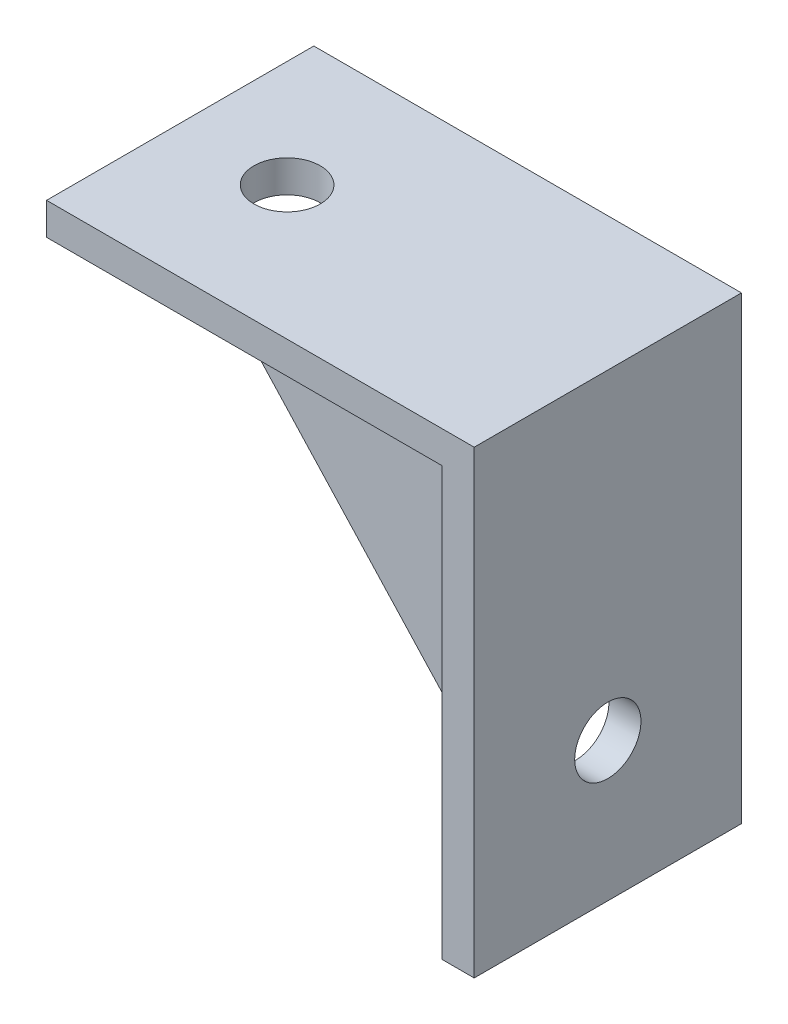
ISO-10303-21;
HEADER;
FILE_DESCRIPTION(('STEP AP214'),'2;1');
FILE_NAME('part.step','',(''),(''),'','','');
FILE_SCHEMA(('AUTOMOTIVE_DESIGN { 1 0 10303 214 1 1 1 1 }'));
ENDSEC;
DATA;
#1=APPLICATION_CONTEXT('core data for automotive mechanical design processes');
#2=APPLICATION_PROTOCOL_DEFINITION('international standard','automotive_design',2000,#1);
#3=PRODUCT_CONTEXT('',#1,'mechanical');
#4=PRODUCT('Part','Part','',(#3));
#5=PRODUCT_RELATED_PRODUCT_CATEGORY('part','',(#4));
#6=PRODUCT_DEFINITION_FORMATION('','',#4);
#7=PRODUCT_DEFINITION_CONTEXT('part definition',#1,'design');
#8=PRODUCT_DEFINITION('design','',#6,#7);
#9=PRODUCT_DEFINITION_SHAPE('','',#8);
#10=(LENGTH_UNIT() NAMED_UNIT(*) SI_UNIT(.MILLI.,.METRE.));
#11=(NAMED_UNIT(*) PLANE_ANGLE_UNIT() SI_UNIT($,.RADIAN.));
#12=(NAMED_UNIT(*) SI_UNIT($,.STERADIAN.) SOLID_ANGLE_UNIT());
#13=UNCERTAINTY_MEASURE_WITH_UNIT(LENGTH_MEASURE(1.E-05),#10,'distance_accuracy_value','');
#14=(GEOMETRIC_REPRESENTATION_CONTEXT(3) GLOBAL_UNCERTAINTY_ASSIGNED_CONTEXT((#13)) GLOBAL_UNIT_ASSIGNED_CONTEXT((#10,
#11,#12)) REPRESENTATION_CONTEXT('',''));
#15=CARTESIAN_POINT('',(0.,0.,0.));
#16=DIRECTION('',(0.,0.,1.));
#17=DIRECTION('',(1.,0.,0.));
#18=AXIS2_PLACEMENT_3D('',#15,#16,#17);
#19=CARTESIAN_POINT('',(0.,0.,0.));
#20=DIRECTION('',(0.,1.,0.));
#21=DIRECTION('',(0.,0.,1.));
#22=AXIS2_PLACEMENT_3D('',#19,#20,#21);
#23=PLANE('',#22);
#24=CARTESIAN_POINT('',(10.,0.,12.5));
#25=DIRECTION('',(0.,1.,0.));
#26=DIRECTION('',(0.,0.,1.));
#27=AXIS2_PLACEMENT_3D('',#24,#25,#26);
#28=CIRCLE('',#27,3.1);
#29=CARTESIAN_POINT('',(10.,0.,15.6));
#30=VERTEX_POINT('',#29);
#31=EDGE_CURVE('E154',#30,#30,#28,.T.);
#32=ORIENTED_EDGE('',*,*,#31,.T.);
#33=EDGE_LOOP('',(#32));
#34=FACE_BOUND('',#33,.T.);
#35=DIRECTION('',(-1.,0.,0.));
#36=VECTOR('',#35,1.);
#37=CARTESIAN_POINT('',(37.,0.,22.5));
#38=LINE('',#37,#36);
#39=CARTESIAN_POINT('',(37.,0.,22.5));
#40=VERTEX_POINT('',#39);
#41=CARTESIAN_POINT('',(15.2752875538916,0.,22.5));
#42=VERTEX_POINT('',#41);
#43=EDGE_CURVE('E120',#40,#42,#38,.T.);
#44=ORIENTED_EDGE('',*,*,#43,.F.);
#45=DIRECTION('',(0.,0.,-1.));
#46=VECTOR('',#45,1.);
#47=CARTESIAN_POINT('',(37.,0.,25.));
#48=LINE('',#47,#46);
#49=CARTESIAN_POINT('',(37.,0.,25.));
#50=VERTEX_POINT('',#49);
#51=EDGE_CURVE('E60',#50,#40,#48,.T.);
#52=ORIENTED_EDGE('',*,*,#51,.F.);
#53=DIRECTION('',(1.,0.,0.));
#54=VECTOR('',#53,1.);
#55=CARTESIAN_POINT('',(0.,0.,25.));
#56=LINE('',#55,#54);
#57=CARTESIAN_POINT('',(0.,0.,25.));
#58=VERTEX_POINT('',#57);
#59=EDGE_CURVE('E174',#58,#50,#56,.T.);
#60=ORIENTED_EDGE('',*,*,#59,.F.);
#61=DIRECTION('',(0.,0.,1.));
#62=VECTOR('',#61,1.);
#63=CARTESIAN_POINT('',(0.,0.,0.));
#64=LINE('',#63,#62);
#65=CARTESIAN_POINT('',(0.,0.,0.));
#66=VERTEX_POINT('',#65);
#67=EDGE_CURVE('E158',#66,#58,#64,.T.);
#68=ORIENTED_EDGE('',*,*,#67,.F.);
#69=DIRECTION('',(-1.,0.,0.));
#70=VECTOR('',#69,1.);
#71=CARTESIAN_POINT('',(0.,0.,0.));
#72=LINE('',#71,#70);
#73=CARTESIAN_POINT('',(37.,0.,0.));
#74=VERTEX_POINT('',#73);
#75=EDGE_CURVE('E165',#74,#66,#72,.T.);
#76=ORIENTED_EDGE('',*,*,#75,.F.);
#77=CARTESIAN_POINT('',(37.,0.,2.5));
#78=VERTEX_POINT('',#77);
#79=EDGE_CURVE('E135',#78,#74,#48,.T.);
#80=ORIENTED_EDGE('',*,*,#79,.F.);
#81=DIRECTION('',(-1.,0.,0.));
#82=VECTOR('',#81,1.);
#83=CARTESIAN_POINT('',(37.,0.,2.5));
#84=LINE('',#83,#82);
#85=CARTESIAN_POINT('',(15.2752875538916,0.,2.5));
#86=VERTEX_POINT('',#85);
#87=EDGE_CURVE('E52',#78,#86,#84,.T.);
#88=ORIENTED_EDGE('',*,*,#87,.T.);
#89=DIRECTION('',(0.,0.,-1.));
#90=VECTOR('',#89,1.);
#91=CARTESIAN_POINT('',(15.2752875538916,0.,22.5));
#92=LINE('',#91,#90);
#93=EDGE_CURVE('E114',#42,#86,#92,.T.);
#94=ORIENTED_EDGE('',*,*,#93,.F.);
#95=EDGE_LOOP('',(#44,#52,#60,#68,#76,#80,#88,#94));
#96=FACE_BOUND('',#95,.T.);
#97=ADVANCED_FACE('F37',(#34,#96),#23,.F.);
#98=CARTESIAN_POINT('',(37.,-40.,25.));
#99=DIRECTION('',(1.,0.,0.));
#100=DIRECTION('',(0.,0.,-1.));
#101=AXIS2_PLACEMENT_3D('',#98,#99,#100);
#102=PLANE('',#101);
#103=CARTESIAN_POINT('',(37.,-27.,12.5));
#104=DIRECTION('',(-1.,0.,0.));
#105=DIRECTION('',(0.,0.,1.));
#106=AXIS2_PLACEMENT_3D('',#103,#104,#105);
#107=CIRCLE('',#106,3.1);
#108=CARTESIAN_POINT('',(37.,-27.,15.6));
#109=VERTEX_POINT('',#108);
#110=EDGE_CURVE('E126',#109,#109,#107,.T.);
#111=ORIENTED_EDGE('',*,*,#110,.F.);
#112=EDGE_LOOP('',(#111));
#113=FACE_BOUND('',#112,.T.);
#114=DIRECTION('',(0.,1.,0.));
#115=VECTOR('',#114,1.);
#116=CARTESIAN_POINT('',(37.,-23.5909327367695,22.5));
#117=LINE('',#116,#115);
#118=CARTESIAN_POINT('',(37.,-23.5909327367695,22.5));
#119=VERTEX_POINT('',#118);
#120=EDGE_CURVE('E119',#119,#40,#117,.T.);
#121=ORIENTED_EDGE('',*,*,#120,.F.);
#122=DIRECTION('',(0.,0.,-1.));
#123=VECTOR('',#122,1.);
#124=CARTESIAN_POINT('',(37.,-23.5909327367695,22.5));
#125=LINE('',#124,#123);
#126=CARTESIAN_POINT('',(37.,-23.5909327367695,2.5));
#127=VERTEX_POINT('',#126);
#128=EDGE_CURVE('E116',#119,#127,#125,.T.);
#129=ORIENTED_EDGE('',*,*,#128,.T.);
#130=DIRECTION('',(0.,1.,0.));
#131=VECTOR('',#130,1.);
#132=CARTESIAN_POINT('',(37.,-23.5909327367695,2.5));
#133=LINE('',#132,#131);
#134=EDGE_CURVE('E123',#127,#78,#133,.T.);
#135=ORIENTED_EDGE('',*,*,#134,.T.);
#136=ORIENTED_EDGE('',*,*,#79,.T.);
#137=DIRECTION('',(0.,1.,0.));
#138=VECTOR('',#137,1.);
#139=CARTESIAN_POINT('',(37.,-40.,0.));
#140=LINE('',#139,#138);
#141=CARTESIAN_POINT('',(37.,-40.,0.));
#142=VERTEX_POINT('',#141);
#143=EDGE_CURVE('E147',#142,#74,#140,.T.);
#144=ORIENTED_EDGE('',*,*,#143,.F.);
#145=DIRECTION('',(0.,0.,-1.));
#146=VECTOR('',#145,1.);
#147=CARTESIAN_POINT('',(37.,-40.,25.));
#148=LINE('',#147,#146);
#149=CARTESIAN_POINT('',(37.,-40.,25.));
#150=VERTEX_POINT('',#149);
#151=EDGE_CURVE('E142',#150,#142,#148,.T.);
#152=ORIENTED_EDGE('',*,*,#151,.F.);
#153=DIRECTION('',(0.,1.,0.));
#154=VECTOR('',#153,1.);
#155=CARTESIAN_POINT('',(37.,-40.,25.));
#156=LINE('',#155,#154);
#157=EDGE_CURVE('E151',#150,#50,#156,.T.);
#158=ORIENTED_EDGE('',*,*,#157,.T.);
#159=ORIENTED_EDGE('',*,*,#51,.T.);
#160=EDGE_LOOP('',(#121,#129,#135,#136,#144,#152,#158,#159));
#161=FACE_BOUND('',#160,.T.);
#162=ADVANCED_FACE('F208',(#113,#161),#102,.F.);
#163=CARTESIAN_POINT('',(0.,3.,0.));
#164=DIRECTION('',(0.,1.,0.));
#165=DIRECTION('',(0.,0.,1.));
#166=AXIS2_PLACEMENT_3D('',#163,#164,#165);
#167=PLANE('',#166);
#168=DIRECTION('',(0.,0.,1.));
#169=VECTOR('',#168,1.);
#170=CARTESIAN_POINT('',(0.,3.,0.));
#171=LINE('',#170,#169);
#172=CARTESIAN_POINT('',(0.,3.,0.));
#173=VERTEX_POINT('',#172);
#174=CARTESIAN_POINT('',(0.,3.,25.));
#175=VERTEX_POINT('',#174);
#176=EDGE_CURVE('E161',#173,#175,#171,.T.);
#177=ORIENTED_EDGE('',*,*,#176,.T.);
#178=DIRECTION('',(1.,0.,0.));
#179=VECTOR('',#178,1.);
#180=CARTESIAN_POINT('',(0.,3.,25.));
#181=LINE('',#180,#179);
#182=CARTESIAN_POINT('',(40.,3.,25.));
#183=VERTEX_POINT('',#182);
#184=EDGE_CURVE('E164',#175,#183,#181,.T.);
#185=ORIENTED_EDGE('',*,*,#184,.T.);
#186=DIRECTION('',(0.,0.,-1.));
#187=VECTOR('',#186,1.);
#188=CARTESIAN_POINT('',(40.,3.,0.));
#189=LINE('',#188,#187);
#190=CARTESIAN_POINT('',(40.,3.,0.));
#191=VERTEX_POINT('',#190);
#192=EDGE_CURVE('E167',#183,#191,#189,.T.);
#193=ORIENTED_EDGE('',*,*,#192,.T.);
#194=DIRECTION('',(-1.,0.,0.));
#195=VECTOR('',#194,1.);
#196=CARTESIAN_POINT('',(0.,3.,0.));
#197=LINE('',#196,#195);
#198=EDGE_CURVE('E169',#191,#173,#197,.T.);
#199=ORIENTED_EDGE('',*,*,#198,.T.);
#200=EDGE_LOOP('',(#177,#185,#193,#199));
#201=FACE_BOUND('',#200,.T.);
#202=CARTESIAN_POINT('',(10.,3.,12.5));
#203=DIRECTION('',(0.,1.,0.));
#204=DIRECTION('',(0.,0.,1.));
#205=AXIS2_PLACEMENT_3D('',#202,#203,#204);
#206=CIRCLE('',#205,3.1);
#207=CARTESIAN_POINT('',(10.,3.,15.6));
#208=VERTEX_POINT('',#207);
#209=EDGE_CURVE('E155',#208,#208,#206,.T.);
#210=ORIENTED_EDGE('',*,*,#209,.F.);
#211=EDGE_LOOP('',(#210));
#212=FACE_BOUND('',#211,.T.);
#213=ADVANCED_FACE('F201',(#201,#212),#167,.T.);
#214=CARTESIAN_POINT('',(0.,3.,0.));
#215=DIRECTION('',(1.,0.,0.));
#216=DIRECTION('',(0.,0.,-1.));
#217=AXIS2_PLACEMENT_3D('',#214,#215,#216);
#218=PLANE('',#217);
#219=ORIENTED_EDGE('',*,*,#67,.T.);
#220=DIRECTION('',(0.,-1.,0.));
#221=VECTOR('',#220,1.);
#222=CARTESIAN_POINT('',(0.,3.,25.));
#223=LINE('',#222,#221);
#224=EDGE_CURVE('E11',#175,#58,#223,.T.);
#225=ORIENTED_EDGE('',*,*,#224,.F.);
#226=ORIENTED_EDGE('',*,*,#176,.F.);
#227=DIRECTION('',(0.,-1.,0.));
#228=VECTOR('',#227,1.);
#229=CARTESIAN_POINT('',(0.,3.,0.));
#230=LINE('',#229,#228);
#231=EDGE_CURVE('E171',#173,#66,#230,.T.);
#232=ORIENTED_EDGE('',*,*,#231,.T.);
#233=EDGE_LOOP('',(#219,#225,#226,#232));
#234=FACE_BOUND('',#233,.T.);
#235=ADVANCED_FACE('F39',(#234),#218,.F.);
#236=CARTESIAN_POINT('',(0.,3.,25.));
#237=DIRECTION('',(0.,0.,-1.));
#238=DIRECTION('',(-1.,0.,0.));
#239=AXIS2_PLACEMENT_3D('',#236,#237,#238);
#240=PLANE('',#239);
#241=ORIENTED_EDGE('',*,*,#59,.T.);
#242=ORIENTED_EDGE('',*,*,#157,.F.);
#243=DIRECTION('',(-1.,0.,0.));
#244=VECTOR('',#243,1.);
#245=CARTESIAN_POINT('',(40.,-40.,25.));
#246=LINE('',#245,#244);
#247=CARTESIAN_POINT('',(40.,-40.,25.));
#248=VERTEX_POINT('',#247);
#249=EDGE_CURVE('E140',#248,#150,#246,.T.);
#250=ORIENTED_EDGE('',*,*,#249,.F.);
#251=DIRECTION('',(0.,-1.,0.));
#252=VECTOR('',#251,1.);
#253=CARTESIAN_POINT('',(40.,3.,25.));
#254=LINE('',#253,#252);
#255=EDGE_CURVE('E45',#183,#248,#254,.T.);
#256=ORIENTED_EDGE('',*,*,#255,.F.);
#257=ORIENTED_EDGE('',*,*,#184,.F.);
#258=ORIENTED_EDGE('',*,*,#224,.T.);
#259=EDGE_LOOP('',(#241,#242,#250,#256,#257,#258));
#260=FACE_BOUND('',#259,.T.);
#261=ADVANCED_FACE('F189',(#260),#240,.F.);
#262=CARTESIAN_POINT('',(40.,3.,0.));
#263=DIRECTION('',(-1.,0.,0.));
#264=DIRECTION('',(0.,0.,1.));
#265=AXIS2_PLACEMENT_3D('',#262,#263,#264);
#266=PLANE('',#265);
#267=CARTESIAN_POINT('',(40.,-27.,12.5));
#268=DIRECTION('',(-1.,0.,0.));
#269=DIRECTION('',(0.,0.,1.));
#270=AXIS2_PLACEMENT_3D('',#267,#268,#269);
#271=CIRCLE('',#270,3.1);
#272=CARTESIAN_POINT('',(40.,-27.,15.6));
#273=VERTEX_POINT('',#272);
#274=EDGE_CURVE('E129',#273,#273,#271,.T.);
#275=ORIENTED_EDGE('',*,*,#274,.T.);
#276=EDGE_LOOP('',(#275));
#277=FACE_BOUND('',#276,.T.);
#278=ORIENTED_EDGE('',*,*,#255,.T.);
#279=DIRECTION('',(0.,0.,1.));
#280=VECTOR('',#279,1.);
#281=CARTESIAN_POINT('',(40.,-40.,25.));
#282=LINE('',#281,#280);
#283=CARTESIAN_POINT('',(40.,-40.,0.));
#284=VERTEX_POINT('',#283);
#285=EDGE_CURVE('E137',#284,#248,#282,.T.);
#286=ORIENTED_EDGE('',*,*,#285,.F.);
#287=DIRECTION('',(0.,-1.,0.));
#288=VECTOR('',#287,1.);
#289=CARTESIAN_POINT('',(40.,3.,0.));
#290=LINE('',#289,#288);
#291=EDGE_CURVE('E179',#191,#284,#290,.T.);
#292=ORIENTED_EDGE('',*,*,#291,.F.);
#293=ORIENTED_EDGE('',*,*,#192,.F.);
#294=EDGE_LOOP('',(#278,#286,#292,#293));
#295=FACE_BOUND('',#294,.T.);
#296=ADVANCED_FACE('F185',(#277,#295),#266,.F.);
#297=CARTESIAN_POINT('',(0.,3.,0.));
#298=DIRECTION('',(0.,0.,1.));
#299=DIRECTION('',(1.,0.,0.));
#300=AXIS2_PLACEMENT_3D('',#297,#298,#299);
#301=PLANE('',#300);
#302=ORIENTED_EDGE('',*,*,#291,.T.);
#303=DIRECTION('',(1.,0.,0.));
#304=VECTOR('',#303,1.);
#305=CARTESIAN_POINT('',(40.,-40.,0.));
#306=LINE('',#305,#304);
#307=EDGE_CURVE('E144',#142,#284,#306,.T.);
#308=ORIENTED_EDGE('',*,*,#307,.F.);
#309=ORIENTED_EDGE('',*,*,#143,.T.);
#310=ORIENTED_EDGE('',*,*,#75,.T.);
#311=ORIENTED_EDGE('',*,*,#231,.F.);
#312=ORIENTED_EDGE('',*,*,#198,.F.);
#313=EDGE_LOOP('',(#302,#308,#309,#310,#311,#312));
#314=FACE_BOUND('',#313,.T.);
#315=ADVANCED_FACE('F196',(#314),#301,.F.);
#316=CARTESIAN_POINT('',(10.,3.,12.5));
#317=DIRECTION('',(0.,-1.,0.));
#318=DIRECTION('',(0.,0.,-1.));
#319=AXIS2_PLACEMENT_3D('',#316,#317,#318);
#320=CYLINDRICAL_SURFACE('',#319,3.1);
#321=ORIENTED_EDGE('',*,*,#209,.T.);
#322=EDGE_LOOP('',(#321));
#323=FACE_BOUND('',#322,.T.);
#324=ORIENTED_EDGE('',*,*,#31,.F.);
#325=EDGE_LOOP('',(#324));
#326=FACE_BOUND('',#325,.T.);
#327=ADVANCED_FACE('F234',(#323,#326),#320,.F.);
#328=CARTESIAN_POINT('',(0.,-40.,0.));
#329=DIRECTION('',(0.,1.,0.));
#330=DIRECTION('',(0.,0.,1.));
#331=AXIS2_PLACEMENT_3D('',#328,#329,#330);
#332=PLANE('',#331);
#333=ORIENTED_EDGE('',*,*,#285,.T.);
#334=ORIENTED_EDGE('',*,*,#249,.T.);
#335=ORIENTED_EDGE('',*,*,#151,.T.);
#336=ORIENTED_EDGE('',*,*,#307,.T.);
#337=EDGE_LOOP('',(#333,#334,#335,#336));
#338=FACE_BOUND('',#337,.T.);
#339=ADVANCED_FACE('F192',(#338),#332,.F.);
#340=CARTESIAN_POINT('',(40.,-27.,12.5));
#341=DIRECTION('',(-1.,0.,0.));
#342=DIRECTION('',(0.,0.,1.));
#343=AXIS2_PLACEMENT_3D('',#340,#341,#342);
#344=CYLINDRICAL_SURFACE('',#343,3.1);
#345=ORIENTED_EDGE('',*,*,#274,.F.);
#346=EDGE_LOOP('',(#345));
#347=FACE_BOUND('',#346,.T.);
#348=ORIENTED_EDGE('',*,*,#110,.T.);
#349=EDGE_LOOP('',(#348));
#350=FACE_BOUND('',#349,.T.);
#351=ADVANCED_FACE('F264',(#347,#350),#344,.F.);
#352=CARTESIAN_POINT('',(15.2752875538916,0.,22.5));
#353=DIRECTION('',(0.735603809494122,0.677412013074565,0.));
#354=DIRECTION('',(-0.677412013074565,0.735603809494122,0.));
#355=AXIS2_PLACEMENT_3D('',#352,#353,#354);
#356=PLANE('',#355);
#357=DIRECTION('',(0.677412013074565,-0.735603809494122,0.));
#358=VECTOR('',#357,1.);
#359=CARTESIAN_POINT('',(15.2752875538916,0.,2.5));
#360=LINE('',#359,#358);
#361=EDGE_CURVE('E209',#86,#127,#360,.T.);
#362=ORIENTED_EDGE('',*,*,#361,.T.);
#363=ORIENTED_EDGE('',*,*,#128,.F.);
#364=DIRECTION('',(0.677412013074565,-0.735603809494122,0.));
#365=VECTOR('',#364,1.);
#366=CARTESIAN_POINT('',(15.2752875538916,0.,22.5));
#367=LINE('',#366,#365);
#368=EDGE_CURVE('E110',#42,#119,#367,.T.);
#369=ORIENTED_EDGE('',*,*,#368,.F.);
#370=ORIENTED_EDGE('',*,*,#93,.T.);
#371=EDGE_LOOP('',(#362,#363,#369,#370));
#372=FACE_BOUND('',#371,.T.);
#373=ADVANCED_FACE('F112',(#372),#356,.F.);
#374=CARTESIAN_POINT('',(0.,0.,22.5));
#375=DIRECTION('',(0.,0.,-1.));
#376=DIRECTION('',(-1.,0.,0.));
#377=AXIS2_PLACEMENT_3D('',#374,#375,#376);
#378=PLANE('',#377);
#379=ORIENTED_EDGE('',*,*,#43,.T.);
#380=ORIENTED_EDGE('',*,*,#368,.T.);
#381=ORIENTED_EDGE('',*,*,#120,.T.);
#382=EDGE_LOOP('',(#379,#380,#381));
#383=FACE_BOUND('',#382,.T.);
#384=ADVANCED_FACE('F122',(#383),#378,.F.);
#385=CARTESIAN_POINT('',(0.,0.,2.5));
#386=DIRECTION('',(0.,0.,-1.));
#387=DIRECTION('',(-1.,0.,0.));
#388=AXIS2_PLACEMENT_3D('',#385,#386,#387);
#389=PLANE('',#388);
#390=ORIENTED_EDGE('',*,*,#87,.F.);
#391=ORIENTED_EDGE('',*,*,#134,.F.);
#392=ORIENTED_EDGE('',*,*,#361,.F.);
#393=EDGE_LOOP('',(#390,#391,#392));
#394=FACE_BOUND('',#393,.T.);
#395=ADVANCED_FACE('F213',(#394),#389,.T.);
#396=CLOSED_SHELL('',(#97,#162,#213,#235,#261,#296,#315,#327,#339,#351,#373,#384,#395));
#397=MANIFOLD_SOLID_BREP('B2',#396);
#398=ADVANCED_BREP_SHAPE_REPRESENTATION('',(#18,#397),#14);
#399=SHAPE_DEFINITION_REPRESENTATION(#9,#398);
ENDSEC;
END-ISO-10303-21;
